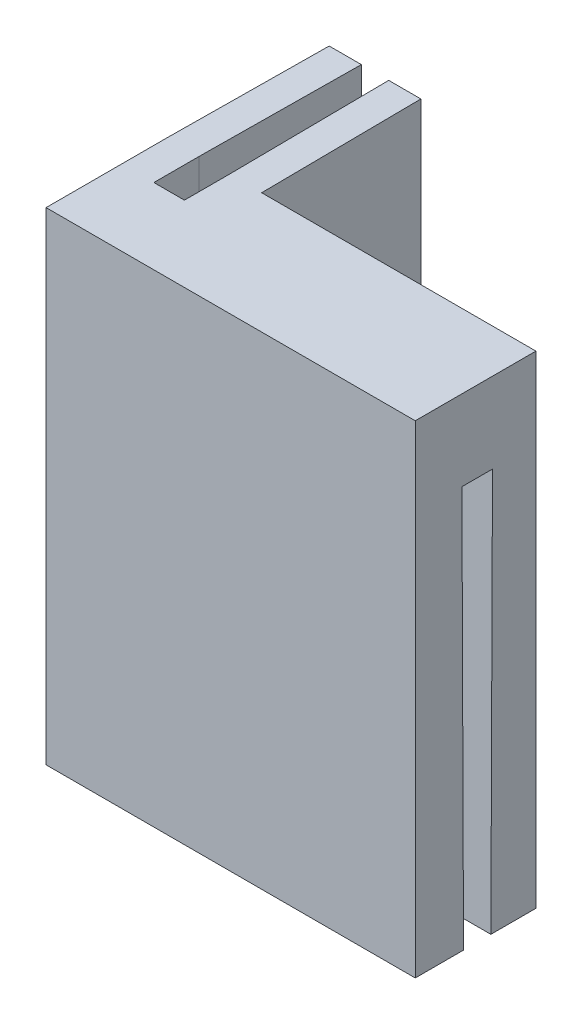
ISO-10303-21;
HEADER;
FILE_DESCRIPTION(('STEP AP214'),'2;1');
FILE_NAME('part.step','',(''),(''),'','','');
FILE_SCHEMA(('AUTOMOTIVE_DESIGN { 1 0 10303 214 1 1 1 1 }'));
ENDSEC;
DATA;
#1=APPLICATION_CONTEXT('core data for automotive mechanical design processes');
#2=APPLICATION_PROTOCOL_DEFINITION('international standard','automotive_design',2000,#1);
#3=PRODUCT_CONTEXT('',#1,'mechanical');
#4=PRODUCT('Part','Part','',(#3));
#5=PRODUCT_RELATED_PRODUCT_CATEGORY('part','',(#4));
#6=PRODUCT_DEFINITION_FORMATION('','',#4);
#7=PRODUCT_DEFINITION_CONTEXT('part definition',#1,'design');
#8=PRODUCT_DEFINITION('design','',#6,#7);
#9=PRODUCT_DEFINITION_SHAPE('','',#8);
#10=(LENGTH_UNIT() NAMED_UNIT(*) SI_UNIT(.MILLI.,.METRE.));
#11=(NAMED_UNIT(*) PLANE_ANGLE_UNIT() SI_UNIT($,.RADIAN.));
#12=(NAMED_UNIT(*) SI_UNIT($,.STERADIAN.) SOLID_ANGLE_UNIT());
#13=UNCERTAINTY_MEASURE_WITH_UNIT(LENGTH_MEASURE(1.E-05),#10,'distance_accuracy_value','');
#14=(GEOMETRIC_REPRESENTATION_CONTEXT(3) GLOBAL_UNCERTAINTY_ASSIGNED_CONTEXT((#13)) GLOBAL_UNIT_ASSIGNED_CONTEXT((#10,
#11,#12)) REPRESENTATION_CONTEXT('',''));
#15=CARTESIAN_POINT('',(0.,0.,0.));
#16=DIRECTION('',(0.,0.,1.));
#17=DIRECTION('',(1.,0.,0.));
#18=AXIS2_PLACEMENT_3D('',#15,#16,#17);
#19=CARTESIAN_POINT('',(0.,0.,0.));
#20=DIRECTION('',(0.,1.,0.));
#21=DIRECTION('',(0.,0.,1.));
#22=AXIS2_PLACEMENT_3D('',#19,#20,#21);
#23=PLANE('',#22);
#24=DIRECTION('',(0.,0.,1.));
#25=VECTOR('',#24,1.);
#26=CARTESIAN_POINT('',(-3.7465,0.,0.));
#27=LINE('',#26,#25);
#28=CARTESIAN_POINT('',(-3.7465,0.,5.715));
#29=VERTEX_POINT('',#28);
#30=CARTESIAN_POINT('',(-3.7465,0.,9.525));
#31=VERTEX_POINT('',#30);
#32=EDGE_CURVE('E173',#29,#31,#27,.T.);
#33=ORIENTED_EDGE('',*,*,#32,.F.);
#34=DIRECTION('',(1.,0.,0.));
#35=VECTOR('',#34,1.);
#36=CARTESIAN_POINT('',(-3.7465,0.,5.715));
#37=LINE('',#36,#35);
#38=CARTESIAN_POINT('',(25.4,0.,5.715));
#39=VERTEX_POINT('',#38);
#40=EDGE_CURVE('E313',#29,#39,#37,.T.);
#41=ORIENTED_EDGE('',*,*,#40,.T.);
#42=DIRECTION('',(0.,0.,-1.));
#43=VECTOR('',#42,1.);
#44=CARTESIAN_POINT('',(25.4,0.,0.));
#45=LINE('',#44,#43);
#46=CARTESIAN_POINT('',(25.4,0.,9.525));
#47=VERTEX_POINT('',#46);
#48=EDGE_CURVE('E286',#47,#39,#45,.T.);
#49=ORIENTED_EDGE('',*,*,#48,.F.);
#50=DIRECTION('',(1.,0.,0.));
#51=VECTOR('',#50,1.);
#52=CARTESIAN_POINT('',(0.,0.,9.525));
#53=LINE('',#52,#51);
#54=EDGE_CURVE('E177',#31,#47,#53,.T.);
#55=ORIENTED_EDGE('',*,*,#54,.F.);
#56=EDGE_LOOP('',(#33,#41,#49,#55));
#57=FACE_BOUND('',#56,.T.);
#58=ADVANCED_FACE('F36',(#57),#23,.F.);
#59=CARTESIAN_POINT('',(25.4,0.,3.556));
#60=VERTEX_POINT('',#59);
#61=CARTESIAN_POINT('',(25.4,0.,0.));
#62=VERTEX_POINT('',#61);
#63=EDGE_CURVE('E277',#60,#62,#45,.T.);
#64=ORIENTED_EDGE('',*,*,#63,.F.);
#65=DIRECTION('',(1.,0.,0.));
#66=VECTOR('',#65,1.);
#67=CARTESIAN_POINT('',(-3.7465,0.,3.556));
#68=LINE('',#67,#66);
#69=CARTESIAN_POINT('',(1.2065,0.,3.556));
#70=VERTEX_POINT('',#69);
#71=EDGE_CURVE('E51',#70,#60,#68,.T.);
#72=ORIENTED_EDGE('',*,*,#71,.F.);
#73=DIRECTION('',(0.,0.,1.));
#74=VECTOR('',#73,1.);
#75=CARTESIAN_POINT('',(1.2065,0.,0.));
#76=LINE('',#75,#74);
#77=CARTESIAN_POINT('',(1.2065,0.,0.));
#78=VERTEX_POINT('',#77);
#79=EDGE_CURVE('E186',#78,#70,#76,.T.);
#80=ORIENTED_EDGE('',*,*,#79,.F.);
#81=DIRECTION('',(-0.01,0.,-0.999949998749938));
#82=VECTOR('',#81,1.);
#83=CARTESIAN_POINT('',(1.20637935,0.,-0.012064396734918));
#84=LINE('',#83,#82);
#85=CARTESIAN_POINT('',(1.0795,0.,-12.6993649841242));
#86=VERTEX_POINT('',#85);
#87=EDGE_CURVE('E135',#78,#86,#84,.T.);
#88=ORIENTED_EDGE('',*,*,#87,.T.);
#89=DIRECTION('',(-1.,0.,0.));
#90=VECTOR('',#89,1.);
#91=CARTESIAN_POINT('',(0.,0.,-12.6993649841242));
#92=LINE('',#91,#90);
#93=CARTESIAN_POINT('',(3.6195,0.,-12.6993649841242));
#94=VERTEX_POINT('',#93);
#95=EDGE_CURVE('E182',#94,#86,#92,.T.);
#96=ORIENTED_EDGE('',*,*,#95,.F.);
#97=DIRECTION('',(-0.00999999999999993,0.,-0.999949998749938));
#98=VECTOR('',#97,1.);
#99=CARTESIAN_POINT('',(3.74612535,0.,-0.0374631267031661));
#100=LINE('',#99,#98);
#101=CARTESIAN_POINT('',(3.7465,0.,0.));
#102=VERTEX_POINT('',#101);
#103=EDGE_CURVE('E180',#102,#94,#100,.T.);
#104=ORIENTED_EDGE('',*,*,#103,.F.);
#105=DIRECTION('',(1.,0.,0.));
#106=VECTOR('',#105,1.);
#107=CARTESIAN_POINT('',(0.,0.,0.));
#108=LINE('',#107,#106);
#109=EDGE_CURVE('E292',#102,#62,#108,.T.);
#110=ORIENTED_EDGE('',*,*,#109,.T.);
#111=EDGE_LOOP('',(#64,#72,#80,#88,#96,#104,#110));
#112=FACE_BOUND('',#111,.T.);
#113=ADVANCED_FACE('F248',(#112),#23,.F.);
#114=CARTESIAN_POINT('',(-1.2065,38.1,0.));
#115=DIRECTION('',(1.,0.,0.));
#116=DIRECTION('',(0.,0.,-1.));
#117=AXIS2_PLACEMENT_3D('',#114,#115,#116);
#118=PLANE('',#117);
#119=DIRECTION('',(0.,0.,1.));
#120=VECTOR('',#119,1.);
#121=CARTESIAN_POINT('',(-1.2065,31.75,0.));
#122=LINE('',#121,#120);
#123=CARTESIAN_POINT('',(-1.2065,31.75,3.42899999999946));
#124=VERTEX_POINT('',#123);
#125=CARTESIAN_POINT('',(-1.2065,31.75,3.556));
#126=VERTEX_POINT('',#125);
#127=EDGE_CURVE('E297',#124,#126,#122,.T.);
#128=ORIENTED_EDGE('',*,*,#127,.F.);
#129=DIRECTION('',(0.,0.999992000095999,-0.00399996800040092));
#130=VECTOR('',#129,1.);
#131=CARTESIAN_POINT('',(-1.2065,38.1136141821731,3.40354554327066));
#132=LINE('',#131,#130);
#133=CARTESIAN_POINT('',(-1.2065,0.,3.556));
#134=VERTEX_POINT('',#133);
#135=EDGE_CURVE('E307',#134,#124,#132,.T.);
#136=ORIENTED_EDGE('',*,*,#135,.F.);
#137=DIRECTION('',(0.,0.,1.));
#138=VECTOR('',#137,1.);
#139=CARTESIAN_POINT('',(-1.2065,0.,0.));
#140=LINE('',#139,#138);
#141=CARTESIAN_POINT('',(-1.2065,0.,0.));
#142=VERTEX_POINT('',#141);
#143=EDGE_CURVE('E160',#142,#134,#140,.T.);
#144=ORIENTED_EDGE('',*,*,#143,.F.);
#145=DIRECTION('',(0.,-1.,0.));
#146=VECTOR('',#145,1.);
#147=CARTESIAN_POINT('',(-1.2065,38.1,0.));
#148=LINE('',#147,#146);
#149=CARTESIAN_POINT('',(-1.2065,38.1,0.));
#150=VERTEX_POINT('',#149);
#151=EDGE_CURVE('E11',#150,#142,#148,.T.);
#152=ORIENTED_EDGE('',*,*,#151,.F.);
#153=DIRECTION('',(0.,0.,1.));
#154=VECTOR('',#153,1.);
#155=CARTESIAN_POINT('',(-1.2065,38.1,0.));
#156=LINE('',#155,#154);
#157=CARTESIAN_POINT('',(-1.2065,38.1,3.556));
#158=VERTEX_POINT('',#157);
#159=EDGE_CURVE('E188',#150,#158,#156,.T.);
#160=ORIENTED_EDGE('',*,*,#159,.T.);
#161=DIRECTION('',(0.,-1.,0.));
#162=VECTOR('',#161,1.);
#163=CARTESIAN_POINT('',(-1.2065,38.1,3.556));
#164=LINE('',#163,#162);
#165=EDGE_CURVE('E60',#158,#126,#164,.T.);
#166=ORIENTED_EDGE('',*,*,#165,.T.);
#167=EDGE_LOOP('',(#128,#136,#144,#152,#160,#166));
#168=FACE_BOUND('',#167,.T.);
#169=ADVANCED_FACE('F38',(#168),#118,.T.);
#170=CARTESIAN_POINT('',(-1.20637935,38.1,-0.012064396734918));
#171=DIRECTION('',(-0.999949998749937,0.,-0.01));
#172=DIRECTION('',(-0.01,0.,0.999949998749938));
#173=AXIS2_PLACEMENT_3D('',#170,#171,#172);
#174=PLANE('',#173);
#175=DIRECTION('',(0.01,0.,-0.999949998749938));
#176=VECTOR('',#175,1.);
#177=CARTESIAN_POINT('',(-1.20637935,0.,-0.012064396734918));
#178=LINE('',#177,#176);
#179=CARTESIAN_POINT('',(-1.0795,0.,-12.6993649841242));
#180=VERTEX_POINT('',#179);
#181=EDGE_CURVE('E163',#142,#180,#178,.T.);
#182=ORIENTED_EDGE('',*,*,#181,.T.);
#183=DIRECTION('',(0.,-1.,0.));
#184=VECTOR('',#183,1.);
#185=CARTESIAN_POINT('',(-1.0795,38.1,-12.6993649841242));
#186=LINE('',#185,#184);
#187=CARTESIAN_POINT('',(-1.0795,38.1,-12.6993649841242));
#188=VERTEX_POINT('',#187);
#189=EDGE_CURVE('E44',#188,#180,#186,.T.);
#190=ORIENTED_EDGE('',*,*,#189,.F.);
#191=DIRECTION('',(0.01,0.,-0.999949998749938));
#192=VECTOR('',#191,1.);
#193=CARTESIAN_POINT('',(-1.20637935,38.1,-0.012064396734918));
#194=LINE('',#193,#192);
#195=EDGE_CURVE('E224',#150,#188,#194,.T.);
#196=ORIENTED_EDGE('',*,*,#195,.F.);
#197=ORIENTED_EDGE('',*,*,#151,.T.);
#198=EDGE_LOOP('',(#182,#190,#196,#197));
#199=FACE_BOUND('',#198,.T.);
#200=ADVANCED_FACE('F212',(#199),#174,.F.);
#201=CARTESIAN_POINT('',(0.,38.1,-12.6993649841242));
#202=DIRECTION('',(0.,0.,-1.));
#203=DIRECTION('',(-1.,0.,0.));
#204=AXIS2_PLACEMENT_3D('',#201,#202,#203);
#205=PLANE('',#204);
#206=DIRECTION('',(1.,0.,0.));
#207=VECTOR('',#206,1.);
#208=CARTESIAN_POINT('',(0.,0.,-12.6993649841242));
#209=LINE('',#208,#207);
#210=CARTESIAN_POINT('',(-3.6195,0.,-12.6993649841242));
#211=VERTEX_POINT('',#210);
#212=EDGE_CURVE('E167',#211,#180,#209,.T.);
#213=ORIENTED_EDGE('',*,*,#212,.F.);
#214=DIRECTION('',(0.,-1.,0.));
#215=VECTOR('',#214,1.);
#216=CARTESIAN_POINT('',(-3.6195,38.1,-12.6993649841242));
#217=LINE('',#216,#215);
#218=CARTESIAN_POINT('',(-3.6195,38.1,-12.6993649841242));
#219=VERTEX_POINT('',#218);
#220=EDGE_CURVE('E202',#219,#211,#217,.T.);
#221=ORIENTED_EDGE('',*,*,#220,.F.);
#222=DIRECTION('',(1.,0.,0.));
#223=VECTOR('',#222,1.);
#224=CARTESIAN_POINT('',(0.,38.1,-12.6993649841242));
#225=LINE('',#224,#223);
#226=EDGE_CURVE('E209',#219,#188,#225,.T.);
#227=ORIENTED_EDGE('',*,*,#226,.T.);
#228=ORIENTED_EDGE('',*,*,#189,.T.);
#229=EDGE_LOOP('',(#213,#221,#227,#228));
#230=FACE_BOUND('',#229,.T.);
#231=ADVANCED_FACE('F207',(#230),#205,.T.);
#232=CARTESIAN_POINT('',(-3.74612535,38.1,-0.0374631267031661));
#233=DIRECTION('',(-0.999949998749937,0.,-0.00999999999999993));
#234=DIRECTION('',(-0.00999999999999993,0.,0.999949998749938));
#235=AXIS2_PLACEMENT_3D('',#232,#233,#234);
#236=PLANE('',#235);
#237=DIRECTION('',(0.00999999999999993,0.,-0.999949998749938));
#238=VECTOR('',#237,1.);
#239=CARTESIAN_POINT('',(-3.74612535,0.,-0.0374631267031661));
#240=LINE('',#239,#238);
#241=CARTESIAN_POINT('',(-3.7465,0.,0.));
#242=VERTEX_POINT('',#241);
#243=EDGE_CURVE('E170',#242,#211,#240,.T.);
#244=ORIENTED_EDGE('',*,*,#243,.F.);
#245=DIRECTION('',(0.,-1.,0.));
#246=VECTOR('',#245,1.);
#247=CARTESIAN_POINT('',(-3.7465,38.1,0.));
#248=LINE('',#247,#246);
#249=CARTESIAN_POINT('',(-3.7465,38.1,0.));
#250=VERTEX_POINT('',#249);
#251=EDGE_CURVE('E200',#250,#242,#248,.T.);
#252=ORIENTED_EDGE('',*,*,#251,.F.);
#253=DIRECTION('',(0.00999999999999993,0.,-0.999949998749938));
#254=VECTOR('',#253,1.);
#255=CARTESIAN_POINT('',(-3.74612535,38.1,-0.0374631267031661));
#256=LINE('',#255,#254);
#257=EDGE_CURVE('E223',#250,#219,#256,.T.);
#258=ORIENTED_EDGE('',*,*,#257,.T.);
#259=ORIENTED_EDGE('',*,*,#220,.T.);
#260=EDGE_LOOP('',(#244,#252,#258,#259));
#261=FACE_BOUND('',#260,.T.);
#262=ADVANCED_FACE('F219',(#261),#236,.T.);
#263=CARTESIAN_POINT('',(-3.7465,38.1,0.));
#264=DIRECTION('',(1.,0.,0.));
#265=DIRECTION('',(0.,0.,-1.));
#266=AXIS2_PLACEMENT_3D('',#263,#264,#265);
#267=PLANE('',#266);
#268=DIRECTION('',(0.,0.,1.));
#269=VECTOR('',#268,1.);
#270=CARTESIAN_POINT('',(-3.7465,31.75,3.42899999999946));
#271=LINE('',#270,#269);
#272=CARTESIAN_POINT('',(-3.7465,31.75,3.42899999999946));
#273=VERTEX_POINT('',#272);
#274=CARTESIAN_POINT('',(-3.7465,31.75,5.84199999999946));
#275=VERTEX_POINT('',#274);
#276=EDGE_CURVE('E316',#273,#275,#271,.T.);
#277=ORIENTED_EDGE('',*,*,#276,.T.);
#278=DIRECTION('',(0.,-0.999992000095999,-0.0039999680003671));
#279=VECTOR('',#278,1.);
#280=CARTESIAN_POINT('',(-3.7465,31.75,5.84199999999946));
#281=LINE('',#280,#279);
#282=EDGE_CURVE('E330',#275,#29,#281,.T.);
#283=ORIENTED_EDGE('',*,*,#282,.T.);
#284=ORIENTED_EDGE('',*,*,#32,.T.);
#285=DIRECTION('',(0.,-1.,0.));
#286=VECTOR('',#285,1.);
#287=CARTESIAN_POINT('',(-3.7465,38.1,9.525));
#288=LINE('',#287,#286);
#289=CARTESIAN_POINT('',(-3.7465,38.1,9.525));
#290=VERTEX_POINT('',#289);
#291=EDGE_CURVE('E197',#290,#31,#288,.T.);
#292=ORIENTED_EDGE('',*,*,#291,.F.);
#293=DIRECTION('',(0.,0.,1.));
#294=VECTOR('',#293,1.);
#295=CARTESIAN_POINT('',(-3.7465,38.1,0.));
#296=LINE('',#295,#294);
#297=EDGE_CURVE('E226',#250,#290,#296,.T.);
#298=ORIENTED_EDGE('',*,*,#297,.F.);
#299=ORIENTED_EDGE('',*,*,#251,.T.);
#300=CARTESIAN_POINT('',(-3.7465,0.,3.556));
#301=VERTEX_POINT('',#300);
#302=EDGE_CURVE('E174',#242,#301,#27,.T.);
#303=ORIENTED_EDGE('',*,*,#302,.T.);
#304=DIRECTION('',(0.,0.999992000095999,-0.00399996800040092));
#305=VECTOR('',#304,1.);
#306=CARTESIAN_POINT('',(-3.7465,0.,3.556));
#307=LINE('',#306,#305);
#308=EDGE_CURVE('E327',#301,#273,#307,.T.);
#309=ORIENTED_EDGE('',*,*,#308,.T.);
#310=EDGE_LOOP('',(#277,#283,#284,#292,#298,#299,#303,#309));
#311=FACE_BOUND('',#310,.T.);
#312=ADVANCED_FACE('F360',(#311),#267,.F.);
#313=CARTESIAN_POINT('',(0.,38.1,9.525));
#314=DIRECTION('',(0.,0.,-1.));
#315=DIRECTION('',(-1.,0.,0.));
#316=AXIS2_PLACEMENT_3D('',#313,#314,#315);
#317=PLANE('',#316);
#318=ORIENTED_EDGE('',*,*,#54,.T.);
#319=DIRECTION('',(0.,-1.,0.));
#320=VECTOR('',#319,1.);
#321=CARTESIAN_POINT('',(25.4,61.7558594696959,9.525));
#322=LINE('',#321,#320);
#323=CARTESIAN_POINT('',(25.4,38.1,9.525));
#324=VERTEX_POINT('',#323);
#325=EDGE_CURVE('E287',#324,#47,#322,.T.);
#326=ORIENTED_EDGE('',*,*,#325,.F.);
#327=DIRECTION('',(1.,0.,0.));
#328=VECTOR('',#327,1.);
#329=CARTESIAN_POINT('',(0.,38.1,9.525));
#330=LINE('',#329,#328);
#331=EDGE_CURVE('E232',#290,#324,#330,.T.);
#332=ORIENTED_EDGE('',*,*,#331,.F.);
#333=ORIENTED_EDGE('',*,*,#291,.T.);
#334=EDGE_LOOP('',(#318,#326,#332,#333));
#335=FACE_BOUND('',#334,.T.);
#336=ADVANCED_FACE('F357',(#335),#317,.F.);
#337=CARTESIAN_POINT('',(3.74612535,38.1,-0.0374631267031661));
#338=DIRECTION('',(-0.999949998749937,0.,0.00999999999999993));
#339=DIRECTION('',(0.00999999999999993,0.,0.999949998749938));
#340=AXIS2_PLACEMENT_3D('',#337,#338,#339);
#341=PLANE('',#340);
#342=ORIENTED_EDGE('',*,*,#103,.T.);
#343=DIRECTION('',(0.,-1.,0.));
#344=VECTOR('',#343,1.);
#345=CARTESIAN_POINT('',(3.6195,38.1,-12.6993649841242));
#346=LINE('',#345,#344);
#347=CARTESIAN_POINT('',(3.6195,38.1,-12.6993649841242));
#348=VERTEX_POINT('',#347);
#349=EDGE_CURVE('E192',#348,#94,#346,.T.);
#350=ORIENTED_EDGE('',*,*,#349,.F.);
#351=DIRECTION('',(-0.00999999999999993,0.,-0.999949998749938));
#352=VECTOR('',#351,1.);
#353=CARTESIAN_POINT('',(3.74612535,38.1,-0.0374631267031661));
#354=LINE('',#353,#352);
#355=CARTESIAN_POINT('',(3.7465,38.1,0.));
#356=VERTEX_POINT('',#355);
#357=EDGE_CURVE('E155',#356,#348,#354,.T.);
#358=ORIENTED_EDGE('',*,*,#357,.F.);
#359=DIRECTION('',(0.,-1.,0.));
#360=VECTOR('',#359,1.);
#361=CARTESIAN_POINT('',(3.7465,38.1,0.));
#362=LINE('',#361,#360);
#363=EDGE_CURVE('E195',#356,#102,#362,.T.);
#364=ORIENTED_EDGE('',*,*,#363,.T.);
#365=EDGE_LOOP('',(#342,#350,#358,#364));
#366=FACE_BOUND('',#365,.T.);
#367=ADVANCED_FACE('F241',(#366),#341,.F.);
#368=CARTESIAN_POINT('',(0.,38.1,-12.6993649841242));
#369=DIRECTION('',(0.,0.,1.));
#370=DIRECTION('',(1.,0.,0.));
#371=AXIS2_PLACEMENT_3D('',#368,#369,#370);
#372=PLANE('',#371);
#373=ORIENTED_EDGE('',*,*,#95,.T.);
#374=DIRECTION('',(0.,-1.,0.));
#375=VECTOR('',#374,1.);
#376=CARTESIAN_POINT('',(1.0795,38.1,-12.6993649841242));
#377=LINE('',#376,#375);
#378=CARTESIAN_POINT('',(1.0795,38.1,-12.6993649841242));
#379=VERTEX_POINT('',#378);
#380=EDGE_CURVE('E136',#379,#86,#377,.T.);
#381=ORIENTED_EDGE('',*,*,#380,.F.);
#382=DIRECTION('',(-1.,0.,0.));
#383=VECTOR('',#382,1.);
#384=CARTESIAN_POINT('',(0.,38.1,-12.6993649841242));
#385=LINE('',#384,#383);
#386=EDGE_CURVE('E152',#348,#379,#385,.T.);
#387=ORIENTED_EDGE('',*,*,#386,.F.);
#388=ORIENTED_EDGE('',*,*,#349,.T.);
#389=EDGE_LOOP('',(#373,#381,#387,#388));
#390=FACE_BOUND('',#389,.T.);
#391=ADVANCED_FACE('F245',(#390),#372,.F.);
#392=CARTESIAN_POINT('',(1.20637935,38.1,-0.012064396734918));
#393=DIRECTION('',(-0.999949998749937,0.,0.01));
#394=DIRECTION('',(0.01,0.,0.999949998749938));
#395=AXIS2_PLACEMENT_3D('',#392,#393,#394);
#396=PLANE('',#395);
#397=ORIENTED_EDGE('',*,*,#87,.F.);
#398=DIRECTION('',(0.,-1.,0.));
#399=VECTOR('',#398,1.);
#400=CARTESIAN_POINT('',(1.2065,38.1,0.));
#401=LINE('',#400,#399);
#402=CARTESIAN_POINT('',(1.2065,38.1,0.));
#403=VERTEX_POINT('',#402);
#404=EDGE_CURVE('E97',#403,#78,#401,.T.);
#405=ORIENTED_EDGE('',*,*,#404,.F.);
#406=DIRECTION('',(-0.01,0.,-0.999949998749938));
#407=VECTOR('',#406,1.);
#408=CARTESIAN_POINT('',(1.20637935,38.1,-0.012064396734918));
#409=LINE('',#408,#407);
#410=EDGE_CURVE('E133',#403,#379,#409,.T.);
#411=ORIENTED_EDGE('',*,*,#410,.T.);
#412=ORIENTED_EDGE('',*,*,#380,.T.);
#413=EDGE_LOOP('',(#397,#405,#411,#412));
#414=FACE_BOUND('',#413,.T.);
#415=ADVANCED_FACE('F131',(#414),#396,.T.);
#416=CARTESIAN_POINT('',(1.2065,38.1,0.));
#417=DIRECTION('',(1.,0.,0.));
#418=DIRECTION('',(0.,0.,-1.));
#419=AXIS2_PLACEMENT_3D('',#416,#417,#418);
#420=PLANE('',#419);
#421=DIRECTION('',(0.,0.999992000095999,-0.00399996800040092));
#422=VECTOR('',#421,1.);
#423=CARTESIAN_POINT('',(1.2065,38.1136141821731,3.40354554327066));
#424=LINE('',#423,#422);
#425=CARTESIAN_POINT('',(1.2065,31.75,3.42899999999946));
#426=VERTEX_POINT('',#425);
#427=EDGE_CURVE('E251',#70,#426,#424,.T.);
#428=ORIENTED_EDGE('',*,*,#427,.T.);
#429=DIRECTION('',(0.,0.,1.));
#430=VECTOR('',#429,1.);
#431=CARTESIAN_POINT('',(1.2065,31.75,0.));
#432=LINE('',#431,#430);
#433=CARTESIAN_POINT('',(1.2065,31.75,3.556));
#434=VERTEX_POINT('',#433);
#435=EDGE_CURVE('E306',#426,#434,#432,.T.);
#436=ORIENTED_EDGE('',*,*,#435,.T.);
#437=DIRECTION('',(0.,-1.,0.));
#438=VECTOR('',#437,1.);
#439=CARTESIAN_POINT('',(1.2065,38.1,3.556));
#440=LINE('',#439,#438);
#441=CARTESIAN_POINT('',(1.2065,38.1,3.556));
#442=VERTEX_POINT('',#441);
#443=EDGE_CURVE('E137',#442,#434,#440,.T.);
#444=ORIENTED_EDGE('',*,*,#443,.F.);
#445=DIRECTION('',(0.,0.,1.));
#446=VECTOR('',#445,1.);
#447=CARTESIAN_POINT('',(1.2065,38.1,0.));
#448=LINE('',#447,#446);
#449=EDGE_CURVE('E140',#403,#442,#448,.T.);
#450=ORIENTED_EDGE('',*,*,#449,.F.);
#451=ORIENTED_EDGE('',*,*,#404,.T.);
#452=ORIENTED_EDGE('',*,*,#79,.T.);
#453=EDGE_LOOP('',(#428,#436,#444,#450,#451,#452));
#454=FACE_BOUND('',#453,.T.);
#455=ADVANCED_FACE('F142',(#454),#420,.F.);
#456=CARTESIAN_POINT('',(0.,38.1,3.556));
#457=DIRECTION('',(0.,0.,-1.));
#458=DIRECTION('',(-1.,0.,0.));
#459=AXIS2_PLACEMENT_3D('',#456,#457,#458);
#460=PLANE('',#459);
#461=DIRECTION('',(1.,0.,0.));
#462=VECTOR('',#461,1.);
#463=CARTESIAN_POINT('',(0.,31.75,3.556));
#464=LINE('',#463,#462);
#465=EDGE_CURVE('E304',#126,#434,#464,.T.);
#466=ORIENTED_EDGE('',*,*,#465,.F.);
#467=ORIENTED_EDGE('',*,*,#165,.F.);
#468=DIRECTION('',(1.,0.,0.));
#469=VECTOR('',#468,1.);
#470=CARTESIAN_POINT('',(0.,38.1,3.556));
#471=LINE('',#470,#469);
#472=EDGE_CURVE('E147',#158,#442,#471,.T.);
#473=ORIENTED_EDGE('',*,*,#472,.T.);
#474=ORIENTED_EDGE('',*,*,#443,.T.);
#475=EDGE_LOOP('',(#466,#467,#473,#474));
#476=FACE_BOUND('',#475,.T.);
#477=ADVANCED_FACE('F303',(#476),#460,.T.);
#478=CARTESIAN_POINT('',(0.,38.1,0.));
#479=DIRECTION('',(0.,1.,0.));
#480=DIRECTION('',(0.,0.,1.));
#481=AXIS2_PLACEMENT_3D('',#478,#479,#480);
#482=PLANE('',#481);
#483=ORIENTED_EDGE('',*,*,#159,.F.);
#484=ORIENTED_EDGE('',*,*,#195,.T.);
#485=ORIENTED_EDGE('',*,*,#226,.F.);
#486=ORIENTED_EDGE('',*,*,#257,.F.);
#487=ORIENTED_EDGE('',*,*,#297,.T.);
#488=ORIENTED_EDGE('',*,*,#331,.T.);
#489=DIRECTION('',(0.,0.,-1.));
#490=VECTOR('',#489,1.);
#491=CARTESIAN_POINT('',(25.4,38.1,0.));
#492=LINE('',#491,#490);
#493=CARTESIAN_POINT('',(25.4,38.1,0.));
#494=VERTEX_POINT('',#493);
#495=EDGE_CURVE('E164',#324,#494,#492,.T.);
#496=ORIENTED_EDGE('',*,*,#495,.T.);
#497=DIRECTION('',(1.,0.,0.));
#498=VECTOR('',#497,1.);
#499=CARTESIAN_POINT('',(0.,38.1,0.));
#500=LINE('',#499,#498);
#501=EDGE_CURVE('E238',#356,#494,#500,.T.);
#502=ORIENTED_EDGE('',*,*,#501,.F.);
#503=ORIENTED_EDGE('',*,*,#357,.T.);
#504=ORIENTED_EDGE('',*,*,#386,.T.);
#505=ORIENTED_EDGE('',*,*,#410,.F.);
#506=ORIENTED_EDGE('',*,*,#449,.T.);
#507=ORIENTED_EDGE('',*,*,#472,.F.);
#508=EDGE_LOOP('',(#483,#484,#485,#486,#487,#488,#496,#502,#503,#504,#505,#506,#507));
#509=FACE_BOUND('',#508,.T.);
#510=ADVANCED_FACE('F150',(#509),#482,.T.);
#511=ORIENTED_EDGE('',*,*,#143,.T.);
#512=EDGE_CURVE('E317',#301,#134,#68,.T.);
#513=ORIENTED_EDGE('',*,*,#512,.F.);
#514=ORIENTED_EDGE('',*,*,#302,.F.);
#515=ORIENTED_EDGE('',*,*,#243,.T.);
#516=ORIENTED_EDGE('',*,*,#212,.T.);
#517=ORIENTED_EDGE('',*,*,#181,.F.);
#518=EDGE_LOOP('',(#511,#513,#514,#515,#516,#517));
#519=FACE_BOUND('',#518,.T.);
#520=ADVANCED_FACE('F214',(#519),#23,.F.);
#521=CARTESIAN_POINT('',(25.4,61.7558594696959,0.));
#522=DIRECTION('',(-1.,0.,0.));
#523=DIRECTION('',(0.,0.,1.));
#524=AXIS2_PLACEMENT_3D('',#521,#522,#523);
#525=PLANE('',#524);
#526=ORIENTED_EDGE('',*,*,#48,.T.);
#527=DIRECTION('',(0.,-0.999992000095999,-0.0039999680003671));
#528=VECTOR('',#527,1.);
#529=CARTESIAN_POINT('',(25.4,31.75,5.84199999999946));
#530=LINE('',#529,#528);
#531=CARTESIAN_POINT('',(25.4,31.75,5.84199999999946));
#532=VERTEX_POINT('',#531);
#533=EDGE_CURVE('E337',#532,#39,#530,.T.);
#534=ORIENTED_EDGE('',*,*,#533,.F.);
#535=DIRECTION('',(0.,0.,1.));
#536=VECTOR('',#535,1.);
#537=CARTESIAN_POINT('',(25.4,31.75,3.42899999999946));
#538=LINE('',#537,#536);
#539=CARTESIAN_POINT('',(25.4,31.75,3.42899999999946));
#540=VERTEX_POINT('',#539);
#541=EDGE_CURVE('E333',#540,#532,#538,.T.);
#542=ORIENTED_EDGE('',*,*,#541,.F.);
#543=DIRECTION('',(0.,0.999992000095999,-0.00399996800040092));
#544=VECTOR('',#543,1.);
#545=CARTESIAN_POINT('',(25.4,0.,3.556));
#546=LINE('',#545,#544);
#547=EDGE_CURVE('E284',#60,#540,#546,.T.);
#548=ORIENTED_EDGE('',*,*,#547,.F.);
#549=ORIENTED_EDGE('',*,*,#63,.T.);
#550=DIRECTION('',(0.,-1.,0.));
#551=VECTOR('',#550,1.);
#552=CARTESIAN_POINT('',(25.4,61.7558594696959,0.));
#553=LINE('',#552,#551);
#554=EDGE_CURVE('E282',#494,#62,#553,.T.);
#555=ORIENTED_EDGE('',*,*,#554,.F.);
#556=ORIENTED_EDGE('',*,*,#495,.F.);
#557=ORIENTED_EDGE('',*,*,#325,.T.);
#558=EDGE_LOOP('',(#526,#534,#542,#548,#549,#555,#556,#557));
#559=FACE_BOUND('',#558,.T.);
#560=ADVANCED_FACE('F280',(#559),#525,.F.);
#561=CARTESIAN_POINT('',(0.,61.7558594696959,0.));
#562=DIRECTION('',(0.,0.,-1.));
#563=DIRECTION('',(-1.,0.,0.));
#564=AXIS2_PLACEMENT_3D('',#561,#562,#563);
#565=PLANE('',#564);
#566=ORIENTED_EDGE('',*,*,#363,.F.);
#567=ORIENTED_EDGE('',*,*,#501,.T.);
#568=ORIENTED_EDGE('',*,*,#554,.T.);
#569=ORIENTED_EDGE('',*,*,#109,.F.);
#570=EDGE_LOOP('',(#566,#567,#568,#569));
#571=FACE_BOUND('',#570,.T.);
#572=ADVANCED_FACE('F291',(#571),#565,.T.);
#573=CARTESIAN_POINT('',(-3.7465,0.,3.556));
#574=DIRECTION('',(0.,-0.00399996800040092,-0.999992000095999));
#575=DIRECTION('',(0.,0.999992000095999,-0.00399996800040092));
#576=AXIS2_PLACEMENT_3D('',#573,#574,#575);
#577=PLANE('',#576);
#578=ORIENTED_EDGE('',*,*,#71,.T.);
#579=ORIENTED_EDGE('',*,*,#547,.T.);
#580=DIRECTION('',(1.,0.,0.));
#581=VECTOR('',#580,1.);
#582=CARTESIAN_POINT('',(-3.7465,31.75,3.42899999999946));
#583=LINE('',#582,#581);
#584=EDGE_CURVE('E319',#426,#540,#583,.T.);
#585=ORIENTED_EDGE('',*,*,#584,.F.);
#586=ORIENTED_EDGE('',*,*,#427,.F.);
#587=EDGE_LOOP('',(#578,#579,#585,#586));
#588=FACE_BOUND('',#587,.T.);
#589=ADVANCED_FACE('F373',(#588),#577,.F.);
#590=CARTESIAN_POINT('',(-3.7465,31.75,5.84199999999946));
#591=DIRECTION('',(0.,-0.0039999680003671,0.999992000095999));
#592=DIRECTION('',(0.,-0.999992000095999,-0.0039999680003671));
#593=AXIS2_PLACEMENT_3D('',#590,#591,#592);
#594=PLANE('',#593);
#595=ORIENTED_EDGE('',*,*,#40,.F.);
#596=ORIENTED_EDGE('',*,*,#282,.F.);
#597=DIRECTION('',(1.,0.,0.));
#598=VECTOR('',#597,1.);
#599=CARTESIAN_POINT('',(-3.7465,31.75,5.84199999999946));
#600=LINE('',#599,#598);
#601=EDGE_CURVE('E312',#275,#532,#600,.T.);
#602=ORIENTED_EDGE('',*,*,#601,.T.);
#603=ORIENTED_EDGE('',*,*,#533,.T.);
#604=EDGE_LOOP('',(#595,#596,#602,#603));
#605=FACE_BOUND('',#604,.T.);
#606=ADVANCED_FACE('F343',(#605),#594,.F.);
#607=CARTESIAN_POINT('',(-3.7465,31.75,3.42899999999946));
#608=DIRECTION('',(0.,1.,0.));
#609=DIRECTION('',(0.,0.,1.));
#610=AXIS2_PLACEMENT_3D('',#607,#608,#609);
#611=PLANE('',#610);
#612=ORIENTED_EDGE('',*,*,#127,.T.);
#613=ORIENTED_EDGE('',*,*,#465,.T.);
#614=ORIENTED_EDGE('',*,*,#435,.F.);
#615=ORIENTED_EDGE('',*,*,#584,.T.);
#616=ORIENTED_EDGE('',*,*,#541,.T.);
#617=ORIENTED_EDGE('',*,*,#601,.F.);
#618=ORIENTED_EDGE('',*,*,#276,.F.);
#619=EDGE_CURVE('E320',#273,#124,#583,.T.);
#620=ORIENTED_EDGE('',*,*,#619,.T.);
#621=EDGE_LOOP('',(#612,#613,#614,#615,#616,#617,#618,#620));
#622=FACE_BOUND('',#621,.T.);
#623=ADVANCED_FACE('F372',(#622),#611,.F.);
#624=ORIENTED_EDGE('',*,*,#135,.T.);
#625=ORIENTED_EDGE('',*,*,#619,.F.);
#626=ORIENTED_EDGE('',*,*,#308,.F.);
#627=ORIENTED_EDGE('',*,*,#512,.T.);
#628=EDGE_LOOP('',(#624,#625,#626,#627));
#629=FACE_BOUND('',#628,.T.);
#630=ADVANCED_FACE('F376',(#629),#577,.F.);
#631=CLOSED_SHELL('',(#58,#113,#169,#200,#231,#262,#312,#336,#367,#391,#415,#455,#477,#510,#520,
#560,#572,#589,#606,#623,#630));
#632=MANIFOLD_SOLID_BREP('B2',#631);
#633=ADVANCED_BREP_SHAPE_REPRESENTATION('',(#18,#632),#14);
#634=SHAPE_DEFINITION_REPRESENTATION(#9,#633);
ENDSEC;
END-ISO-10303-21;
